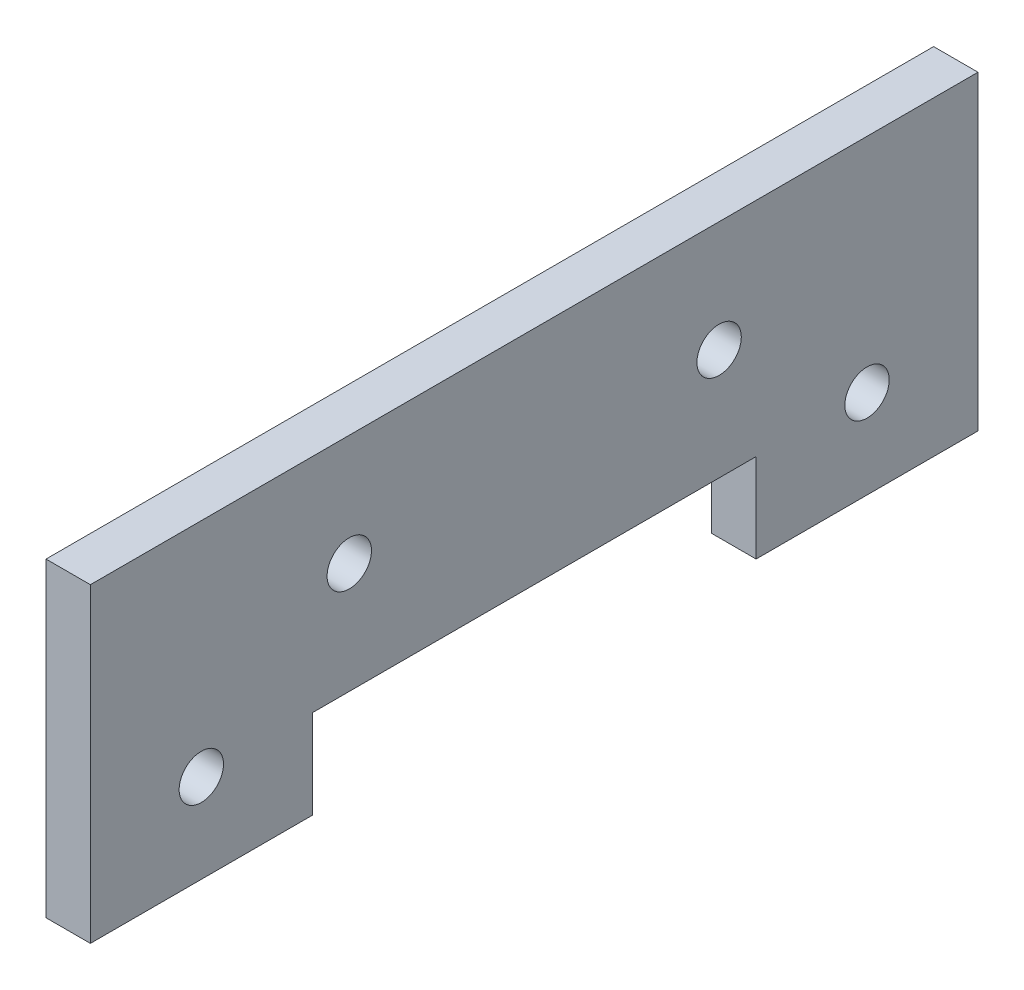
ISO-10303-21;
HEADER;
FILE_DESCRIPTION(('STEP AP214'),'2;1');
FILE_NAME('part.step','',(''),(''),'','','');
FILE_SCHEMA(('AUTOMOTIVE_DESIGN { 1 0 10303 214 1 1 1 1 }'));
ENDSEC;
DATA;
#1=APPLICATION_CONTEXT('core data for automotive mechanical design processes');
#2=APPLICATION_PROTOCOL_DEFINITION('international standard','automotive_design',2000,#1);
#3=PRODUCT_CONTEXT('',#1,'mechanical');
#4=PRODUCT('Part','Part','',(#3));
#5=PRODUCT_RELATED_PRODUCT_CATEGORY('part','',(#4));
#6=PRODUCT_DEFINITION_FORMATION('','',#4);
#7=PRODUCT_DEFINITION_CONTEXT('part definition',#1,'design');
#8=PRODUCT_DEFINITION('design','',#6,#7);
#9=PRODUCT_DEFINITION_SHAPE('','',#8);
#10=(LENGTH_UNIT() NAMED_UNIT(*) SI_UNIT(.MILLI.,.METRE.));
#11=(NAMED_UNIT(*) PLANE_ANGLE_UNIT() SI_UNIT($,.RADIAN.));
#12=(NAMED_UNIT(*) SI_UNIT($,.STERADIAN.) SOLID_ANGLE_UNIT());
#13=UNCERTAINTY_MEASURE_WITH_UNIT(LENGTH_MEASURE(1.E-05),#10,'distance_accuracy_value','');
#14=(GEOMETRIC_REPRESENTATION_CONTEXT(3) GLOBAL_UNCERTAINTY_ASSIGNED_CONTEXT((#13)) GLOBAL_UNIT_ASSIGNED_CONTEXT((#10,
#11,#12)) REPRESENTATION_CONTEXT('',''));
#15=CARTESIAN_POINT('',(0.,0.,0.));
#16=DIRECTION('',(0.,0.,1.));
#17=DIRECTION('',(1.,0.,0.));
#18=AXIS2_PLACEMENT_3D('',#15,#16,#17);
#19=CARTESIAN_POINT('',(3.,-21.,0.));
#20=DIRECTION('',(0.,0.,-1.));
#21=DIRECTION('',(-1.,0.,0.));
#22=AXIS2_PLACEMENT_3D('',#19,#20,#21);
#23=PLANE('',#22);
#24=DIRECTION('',(0.,-1.,0.));
#25=VECTOR('',#24,1.);
#26=CARTESIAN_POINT('',(0.,-21.,0.));
#27=LINE('',#26,#25);
#28=CARTESIAN_POINT('',(0.,0.,0.));
#29=VERTEX_POINT('',#28);
#30=CARTESIAN_POINT('',(0.,-21.,0.));
#31=VERTEX_POINT('',#30);
#32=EDGE_CURVE('E135',#29,#31,#27,.T.);
#33=ORIENTED_EDGE('',*,*,#32,.T.);
#34=DIRECTION('',(-1.,0.,0.));
#35=VECTOR('',#34,1.);
#36=CARTESIAN_POINT('',(3.,-21.,0.));
#37=LINE('',#36,#35);
#38=CARTESIAN_POINT('',(3.,-21.,0.));
#39=VERTEX_POINT('',#38);
#40=EDGE_CURVE('E11',#39,#31,#37,.T.);
#41=ORIENTED_EDGE('',*,*,#40,.F.);
#42=DIRECTION('',(0.,-1.,0.));
#43=VECTOR('',#42,1.);
#44=CARTESIAN_POINT('',(3.,-21.,0.));
#45=LINE('',#44,#43);
#46=CARTESIAN_POINT('',(3.,0.,0.));
#47=VERTEX_POINT('',#46);
#48=EDGE_CURVE('E150',#47,#39,#45,.T.);
#49=ORIENTED_EDGE('',*,*,#48,.F.);
#50=DIRECTION('',(-1.,0.,0.));
#51=VECTOR('',#50,1.);
#52=CARTESIAN_POINT('',(3.,0.,0.));
#53=LINE('',#52,#51);
#54=EDGE_CURVE('E131',#47,#29,#53,.T.);
#55=ORIENTED_EDGE('',*,*,#54,.T.);
#56=EDGE_LOOP('',(#33,#41,#49,#55));
#57=FACE_BOUND('',#56,.T.);
#58=ADVANCED_FACE('F39',(#57),#23,.F.);
#59=CARTESIAN_POINT('',(3.,-21.,-15.));
#60=DIRECTION('',(0.,1.,0.));
#61=DIRECTION('',(0.,0.,1.));
#62=AXIS2_PLACEMENT_3D('',#59,#60,#61);
#63=PLANE('',#62);
#64=DIRECTION('',(0.,0.,-1.));
#65=VECTOR('',#64,1.);
#66=CARTESIAN_POINT('',(0.,-21.,-15.));
#67=LINE('',#66,#65);
#68=CARTESIAN_POINT('',(0.,-21.,-15.));
#69=VERTEX_POINT('',#68);
#70=EDGE_CURVE('E138',#31,#69,#67,.T.);
#71=ORIENTED_EDGE('',*,*,#70,.T.);
#72=DIRECTION('',(-1.,0.,0.));
#73=VECTOR('',#72,1.);
#74=CARTESIAN_POINT('',(3.,-21.,-15.));
#75=LINE('',#74,#73);
#76=CARTESIAN_POINT('',(3.,-21.,-15.));
#77=VERTEX_POINT('',#76);
#78=EDGE_CURVE('E47',#77,#69,#75,.T.);
#79=ORIENTED_EDGE('',*,*,#78,.F.);
#80=DIRECTION('',(0.,0.,-1.));
#81=VECTOR('',#80,1.);
#82=CARTESIAN_POINT('',(3.,-21.,-15.));
#83=LINE('',#82,#81);
#84=EDGE_CURVE('E98',#39,#77,#83,.T.);
#85=ORIENTED_EDGE('',*,*,#84,.F.);
#86=ORIENTED_EDGE('',*,*,#40,.T.);
#87=EDGE_LOOP('',(#71,#79,#85,#86));
#88=FACE_BOUND('',#87,.T.);
#89=ADVANCED_FACE('F235',(#88),#63,.F.);
#90=CARTESIAN_POINT('',(3.,-15.,-15.));
#91=DIRECTION('',(0.,0.,1.));
#92=DIRECTION('',(0.,-1.,0.));
#93=AXIS2_PLACEMENT_3D('',#90,#91,#92);
#94=PLANE('',#93);
#95=DIRECTION('',(0.,1.,0.));
#96=VECTOR('',#95,1.);
#97=CARTESIAN_POINT('',(0.,-15.,-15.));
#98=LINE('',#97,#96);
#99=CARTESIAN_POINT('',(0.,-15.,-15.));
#100=VERTEX_POINT('',#99);
#101=EDGE_CURVE('E141',#69,#100,#98,.T.);
#102=ORIENTED_EDGE('',*,*,#101,.T.);
#103=DIRECTION('',(-1.,0.,0.));
#104=VECTOR('',#103,1.);
#105=CARTESIAN_POINT('',(3.,-15.,-15.));
#106=LINE('',#105,#104);
#107=CARTESIAN_POINT('',(3.,-15.,-15.));
#108=VERTEX_POINT('',#107);
#109=EDGE_CURVE('E157',#108,#100,#106,.T.);
#110=ORIENTED_EDGE('',*,*,#109,.F.);
#111=DIRECTION('',(0.,1.,0.));
#112=VECTOR('',#111,1.);
#113=CARTESIAN_POINT('',(3.,-15.,-15.));
#114=LINE('',#113,#112);
#115=EDGE_CURVE('E165',#77,#108,#114,.T.);
#116=ORIENTED_EDGE('',*,*,#115,.F.);
#117=ORIENTED_EDGE('',*,*,#78,.T.);
#118=EDGE_LOOP('',(#102,#110,#116,#117));
#119=FACE_BOUND('',#118,.T.);
#120=ADVANCED_FACE('F163',(#119),#94,.F.);
#121=CARTESIAN_POINT('',(3.,-15.,-45.));
#122=DIRECTION('',(0.,1.,0.));
#123=DIRECTION('',(0.,0.,1.));
#124=AXIS2_PLACEMENT_3D('',#121,#122,#123);
#125=PLANE('',#124);
#126=DIRECTION('',(0.,0.,-1.));
#127=VECTOR('',#126,1.);
#128=CARTESIAN_POINT('',(0.,-15.,-45.));
#129=LINE('',#128,#127);
#130=CARTESIAN_POINT('',(0.,-15.,-45.));
#131=VERTEX_POINT('',#130);
#132=EDGE_CURVE('E143',#100,#131,#129,.T.);
#133=ORIENTED_EDGE('',*,*,#132,.T.);
#134=DIRECTION('',(-1.,0.,0.));
#135=VECTOR('',#134,1.);
#136=CARTESIAN_POINT('',(3.,-15.,-45.));
#137=LINE('',#136,#135);
#138=CARTESIAN_POINT('',(3.,-15.,-45.));
#139=VERTEX_POINT('',#138);
#140=EDGE_CURVE('E154',#139,#131,#137,.T.);
#141=ORIENTED_EDGE('',*,*,#140,.F.);
#142=DIRECTION('',(0.,0.,-1.));
#143=VECTOR('',#142,1.);
#144=CARTESIAN_POINT('',(3.,-15.,-45.));
#145=LINE('',#144,#143);
#146=EDGE_CURVE('E177',#108,#139,#145,.T.);
#147=ORIENTED_EDGE('',*,*,#146,.F.);
#148=ORIENTED_EDGE('',*,*,#109,.T.);
#149=EDGE_LOOP('',(#133,#141,#147,#148));
#150=FACE_BOUND('',#149,.T.);
#151=ADVANCED_FACE('F173',(#150),#125,.F.);
#152=CARTESIAN_POINT('',(3.,-21.,-45.));
#153=DIRECTION('',(0.,0.,-1.));
#154=DIRECTION('',(-1.,0.,0.));
#155=AXIS2_PLACEMENT_3D('',#152,#153,#154);
#156=PLANE('',#155);
#157=DIRECTION('',(0.,-1.,0.));
#158=VECTOR('',#157,1.);
#159=CARTESIAN_POINT('',(0.,-21.,-45.));
#160=LINE('',#159,#158);
#161=CARTESIAN_POINT('',(0.,-21.,-45.));
#162=VERTEX_POINT('',#161);
#163=EDGE_CURVE('E145',#131,#162,#160,.T.);
#164=ORIENTED_EDGE('',*,*,#163,.T.);
#165=DIRECTION('',(-1.,0.,0.));
#166=VECTOR('',#165,1.);
#167=CARTESIAN_POINT('',(3.,-21.,-45.));
#168=LINE('',#167,#166);
#169=CARTESIAN_POINT('',(3.,-21.,-45.));
#170=VERTEX_POINT('',#169);
#171=EDGE_CURVE('E126',#170,#162,#168,.T.);
#172=ORIENTED_EDGE('',*,*,#171,.F.);
#173=DIRECTION('',(0.,-1.,0.));
#174=VECTOR('',#173,1.);
#175=CARTESIAN_POINT('',(3.,-21.,-45.));
#176=LINE('',#175,#174);
#177=EDGE_CURVE('E117',#139,#170,#176,.T.);
#178=ORIENTED_EDGE('',*,*,#177,.F.);
#179=ORIENTED_EDGE('',*,*,#140,.T.);
#180=EDGE_LOOP('',(#164,#172,#178,#179));
#181=FACE_BOUND('',#180,.T.);
#182=ADVANCED_FACE('F176',(#181),#156,.F.);
#183=CARTESIAN_POINT('',(3.,-21.,-60.));
#184=DIRECTION('',(0.,1.,0.));
#185=DIRECTION('',(0.,0.,1.));
#186=AXIS2_PLACEMENT_3D('',#183,#184,#185);
#187=PLANE('',#186);
#188=DIRECTION('',(0.,0.,-1.));
#189=VECTOR('',#188,1.);
#190=CARTESIAN_POINT('',(0.,-21.,-60.));
#191=LINE('',#190,#189);
#192=CARTESIAN_POINT('',(0.,-21.,-60.));
#193=VERTEX_POINT('',#192);
#194=EDGE_CURVE('E125',#162,#193,#191,.T.);
#195=ORIENTED_EDGE('',*,*,#194,.T.);
#196=DIRECTION('',(-1.,0.,0.));
#197=VECTOR('',#196,1.);
#198=CARTESIAN_POINT('',(3.,-21.,-60.));
#199=LINE('',#198,#197);
#200=CARTESIAN_POINT('',(3.,-21.,-60.));
#201=VERTEX_POINT('',#200);
#202=EDGE_CURVE('E122',#201,#193,#199,.T.);
#203=ORIENTED_EDGE('',*,*,#202,.F.);
#204=DIRECTION('',(0.,0.,-1.));
#205=VECTOR('',#204,1.);
#206=CARTESIAN_POINT('',(3.,-21.,-60.));
#207=LINE('',#206,#205);
#208=EDGE_CURVE('E111',#170,#201,#207,.T.);
#209=ORIENTED_EDGE('',*,*,#208,.F.);
#210=ORIENTED_EDGE('',*,*,#171,.T.);
#211=EDGE_LOOP('',(#195,#203,#209,#210));
#212=FACE_BOUND('',#211,.T.);
#213=ADVANCED_FACE('F123',(#212),#187,.F.);
#214=CARTESIAN_POINT('',(3.,0.,-60.));
#215=DIRECTION('',(0.,0.,1.));
#216=DIRECTION('',(1.,0.,0.));
#217=AXIS2_PLACEMENT_3D('',#214,#215,#216);
#218=PLANE('',#217);
#219=DIRECTION('',(0.,1.,0.));
#220=VECTOR('',#219,1.);
#221=CARTESIAN_POINT('',(0.,0.,-60.));
#222=LINE('',#221,#220);
#223=CARTESIAN_POINT('',(0.,0.,-60.));
#224=VERTEX_POINT('',#223);
#225=EDGE_CURVE('E84',#193,#224,#222,.T.);
#226=ORIENTED_EDGE('',*,*,#225,.T.);
#227=DIRECTION('',(-1.,0.,0.));
#228=VECTOR('',#227,1.);
#229=CARTESIAN_POINT('',(3.,0.,-60.));
#230=LINE('',#229,#228);
#231=CARTESIAN_POINT('',(3.,0.,-60.));
#232=VERTEX_POINT('',#231);
#233=EDGE_CURVE('E127',#232,#224,#230,.T.);
#234=ORIENTED_EDGE('',*,*,#233,.F.);
#235=DIRECTION('',(0.,1.,0.));
#236=VECTOR('',#235,1.);
#237=CARTESIAN_POINT('',(3.,0.,-60.));
#238=LINE('',#237,#236);
#239=EDGE_CURVE('E115',#201,#232,#238,.T.);
#240=ORIENTED_EDGE('',*,*,#239,.F.);
#241=ORIENTED_EDGE('',*,*,#202,.T.);
#242=EDGE_LOOP('',(#226,#234,#240,#241));
#243=FACE_BOUND('',#242,.T.);
#244=ADVANCED_FACE('F129',(#243),#218,.F.);
#245=CARTESIAN_POINT('',(3.,0.,0.));
#246=DIRECTION('',(0.,-1.,0.));
#247=DIRECTION('',(0.,0.,-1.));
#248=AXIS2_PLACEMENT_3D('',#245,#246,#247);
#249=PLANE('',#248);
#250=DIRECTION('',(0.,0.,1.));
#251=VECTOR('',#250,1.);
#252=CARTESIAN_POINT('',(0.,0.,0.));
#253=LINE('',#252,#251);
#254=EDGE_CURVE('E90',#224,#29,#253,.T.);
#255=ORIENTED_EDGE('',*,*,#254,.T.);
#256=ORIENTED_EDGE('',*,*,#54,.F.);
#257=DIRECTION('',(0.,0.,1.));
#258=VECTOR('',#257,1.);
#259=CARTESIAN_POINT('',(3.,0.,0.));
#260=LINE('',#259,#258);
#261=EDGE_CURVE('E55',#232,#47,#260,.T.);
#262=ORIENTED_EDGE('',*,*,#261,.F.);
#263=ORIENTED_EDGE('',*,*,#233,.T.);
#264=EDGE_LOOP('',(#255,#256,#262,#263));
#265=FACE_BOUND('',#264,.T.);
#266=ADVANCED_FACE('F219',(#265),#249,.F.);
#267=CARTESIAN_POINT('',(3.,0.,0.));
#268=DIRECTION('',(-1.,0.,0.));
#269=DIRECTION('',(0.,0.,1.));
#270=AXIS2_PLACEMENT_3D('',#267,#268,#269);
#271=PLANE('',#270);
#272=CARTESIAN_POINT('',(3.,-15.,-7.5));
#273=DIRECTION('',(1.,0.,0.));
#274=DIRECTION('',(0.,0.,-1.));
#275=AXIS2_PLACEMENT_3D('',#272,#273,#274);
#276=CIRCLE('',#275,1.5);
#277=CARTESIAN_POINT('',(3.,-15.,-9.));
#278=VERTEX_POINT('',#277);
#279=EDGE_CURVE('E189',#278,#278,#276,.T.);
#280=ORIENTED_EDGE('',*,*,#279,.F.);
#281=EDGE_LOOP('',(#280));
#282=FACE_BOUND('',#281,.T.);
#283=CARTESIAN_POINT('',(3.,-15.,-52.5));
#284=DIRECTION('',(1.,0.,0.));
#285=DIRECTION('',(0.,0.,-1.));
#286=AXIS2_PLACEMENT_3D('',#283,#284,#285);
#287=CIRCLE('',#286,1.5);
#288=CARTESIAN_POINT('',(3.,-15.,-54.));
#289=VERTEX_POINT('',#288);
#290=EDGE_CURVE('E195',#289,#289,#287,.T.);
#291=ORIENTED_EDGE('',*,*,#290,.F.);
#292=EDGE_LOOP('',(#291));
#293=FACE_BOUND('',#292,.T.);
#294=CARTESIAN_POINT('',(3.,-7.5,-17.5));
#295=DIRECTION('',(1.,0.,0.));
#296=DIRECTION('',(0.,0.,-1.));
#297=AXIS2_PLACEMENT_3D('',#294,#295,#296);
#298=CIRCLE('',#297,1.5);
#299=CARTESIAN_POINT('',(3.,-7.5,-19.));
#300=VERTEX_POINT('',#299);
#301=EDGE_CURVE('E201',#300,#300,#298,.T.);
#302=ORIENTED_EDGE('',*,*,#301,.F.);
#303=EDGE_LOOP('',(#302));
#304=FACE_BOUND('',#303,.T.);
#305=CARTESIAN_POINT('',(3.,-7.5,-42.5));
#306=DIRECTION('',(1.,0.,0.));
#307=DIRECTION('',(0.,0.,-1.));
#308=AXIS2_PLACEMENT_3D('',#305,#306,#307);
#309=CIRCLE('',#308,1.5);
#310=CARTESIAN_POINT('',(3.,-7.5,-44.));
#311=VERTEX_POINT('',#310);
#312=EDGE_CURVE('E183',#311,#311,#309,.T.);
#313=ORIENTED_EDGE('',*,*,#312,.F.);
#314=EDGE_LOOP('',(#313));
#315=FACE_BOUND('',#314,.T.);
#316=ORIENTED_EDGE('',*,*,#48,.T.);
#317=ORIENTED_EDGE('',*,*,#84,.T.);
#318=ORIENTED_EDGE('',*,*,#115,.T.);
#319=ORIENTED_EDGE('',*,*,#146,.T.);
#320=ORIENTED_EDGE('',*,*,#177,.T.);
#321=ORIENTED_EDGE('',*,*,#208,.T.);
#322=ORIENTED_EDGE('',*,*,#239,.T.);
#323=ORIENTED_EDGE('',*,*,#261,.T.);
#324=EDGE_LOOP('',(#316,#317,#318,#319,#320,#321,#322,#323));
#325=FACE_BOUND('',#324,.T.);
#326=ADVANCED_FACE('F113',(#282,#293,#304,#315,#325),#271,.F.);
#327=CARTESIAN_POINT('',(0.,0.,0.));
#328=DIRECTION('',(-1.,0.,0.));
#329=DIRECTION('',(0.,0.,1.));
#330=AXIS2_PLACEMENT_3D('',#327,#328,#329);
#331=PLANE('',#330);
#332=CARTESIAN_POINT('',(0.,-15.,-7.5));
#333=DIRECTION('',(1.,0.,0.));
#334=DIRECTION('',(0.,0.,-1.));
#335=AXIS2_PLACEMENT_3D('',#332,#333,#334);
#336=CIRCLE('',#335,1.5);
#337=CARTESIAN_POINT('',(0.,-15.,-9.));
#338=VERTEX_POINT('',#337);
#339=EDGE_CURVE('E192',#338,#338,#336,.T.);
#340=ORIENTED_EDGE('',*,*,#339,.T.);
#341=EDGE_LOOP('',(#340));
#342=FACE_BOUND('',#341,.T.);
#343=CARTESIAN_POINT('',(0.,-15.,-52.5));
#344=DIRECTION('',(1.,0.,0.));
#345=DIRECTION('',(0.,0.,-1.));
#346=AXIS2_PLACEMENT_3D('',#343,#344,#345);
#347=CIRCLE('',#346,1.5);
#348=CARTESIAN_POINT('',(0.,-15.,-54.));
#349=VERTEX_POINT('',#348);
#350=EDGE_CURVE('E198',#349,#349,#347,.T.);
#351=ORIENTED_EDGE('',*,*,#350,.T.);
#352=EDGE_LOOP('',(#351));
#353=FACE_BOUND('',#352,.T.);
#354=CARTESIAN_POINT('',(0.,-7.5,-17.5));
#355=DIRECTION('',(1.,0.,0.));
#356=DIRECTION('',(0.,0.,-1.));
#357=AXIS2_PLACEMENT_3D('',#354,#355,#356);
#358=CIRCLE('',#357,1.5);
#359=CARTESIAN_POINT('',(0.,-7.5,-19.));
#360=VERTEX_POINT('',#359);
#361=EDGE_CURVE('E186',#360,#360,#358,.T.);
#362=ORIENTED_EDGE('',*,*,#361,.T.);
#363=EDGE_LOOP('',(#362));
#364=FACE_BOUND('',#363,.T.);
#365=CARTESIAN_POINT('',(0.,-7.5,-42.5));
#366=DIRECTION('',(1.,0.,0.));
#367=DIRECTION('',(0.,0.,-1.));
#368=AXIS2_PLACEMENT_3D('',#365,#366,#367);
#369=CIRCLE('',#368,1.5);
#370=CARTESIAN_POINT('',(0.,-7.5,-44.));
#371=VERTEX_POINT('',#370);
#372=EDGE_CURVE('E139',#371,#371,#369,.T.);
#373=ORIENTED_EDGE('',*,*,#372,.T.);
#374=EDGE_LOOP('',(#373));
#375=FACE_BOUND('',#374,.T.);
#376=ORIENTED_EDGE('',*,*,#32,.F.);
#377=ORIENTED_EDGE('',*,*,#254,.F.);
#378=ORIENTED_EDGE('',*,*,#225,.F.);
#379=ORIENTED_EDGE('',*,*,#194,.F.);
#380=ORIENTED_EDGE('',*,*,#163,.F.);
#381=ORIENTED_EDGE('',*,*,#132,.F.);
#382=ORIENTED_EDGE('',*,*,#101,.F.);
#383=ORIENTED_EDGE('',*,*,#70,.F.);
#384=EDGE_LOOP('',(#376,#377,#378,#379,#380,#381,#382,#383));
#385=FACE_BOUND('',#384,.T.);
#386=ADVANCED_FACE('F169',(#342,#353,#364,#375,#385),#331,.T.);
#387=CARTESIAN_POINT('',(0.,-7.5,-42.5));
#388=DIRECTION('',(1.,0.,0.));
#389=DIRECTION('',(0.,0.,-1.));
#390=AXIS2_PLACEMENT_3D('',#387,#388,#389);
#391=CYLINDRICAL_SURFACE('',#390,1.5);
#392=ORIENTED_EDGE('',*,*,#372,.F.);
#393=EDGE_LOOP('',(#392));
#394=FACE_BOUND('',#393,.T.);
#395=ORIENTED_EDGE('',*,*,#312,.T.);
#396=EDGE_LOOP('',(#395));
#397=FACE_BOUND('',#396,.T.);
#398=ADVANCED_FACE('F213',(#394,#397),#391,.F.);
#399=CARTESIAN_POINT('',(0.,-7.5,-17.5));
#400=DIRECTION('',(1.,0.,0.));
#401=DIRECTION('',(0.,0.,-1.));
#402=AXIS2_PLACEMENT_3D('',#399,#400,#401);
#403=CYLINDRICAL_SURFACE('',#402,1.5);
#404=ORIENTED_EDGE('',*,*,#361,.F.);
#405=EDGE_LOOP('',(#404));
#406=FACE_BOUND('',#405,.T.);
#407=ORIENTED_EDGE('',*,*,#301,.T.);
#408=EDGE_LOOP('',(#407));
#409=FACE_BOUND('',#408,.T.);
#410=ADVANCED_FACE('F209',(#406,#409),#403,.F.);
#411=CARTESIAN_POINT('',(0.,-15.,-52.5));
#412=DIRECTION('',(1.,0.,0.));
#413=DIRECTION('',(0.,0.,-1.));
#414=AXIS2_PLACEMENT_3D('',#411,#412,#413);
#415=CYLINDRICAL_SURFACE('',#414,1.5);
#416=ORIENTED_EDGE('',*,*,#350,.F.);
#417=EDGE_LOOP('',(#416));
#418=FACE_BOUND('',#417,.T.);
#419=ORIENTED_EDGE('',*,*,#290,.T.);
#420=EDGE_LOOP('',(#419));
#421=FACE_BOUND('',#420,.T.);
#422=ADVANCED_FACE('F212',(#418,#421),#415,.F.);
#423=CARTESIAN_POINT('',(0.,-15.,-7.5));
#424=DIRECTION('',(1.,0.,0.));
#425=DIRECTION('',(0.,0.,-1.));
#426=AXIS2_PLACEMENT_3D('',#423,#424,#425);
#427=CYLINDRICAL_SURFACE('',#426,1.5);
#428=ORIENTED_EDGE('',*,*,#339,.F.);
#429=EDGE_LOOP('',(#428));
#430=FACE_BOUND('',#429,.T.);
#431=ORIENTED_EDGE('',*,*,#279,.T.);
#432=EDGE_LOOP('',(#431));
#433=FACE_BOUND('',#432,.T.);
#434=ADVANCED_FACE('F311',(#430,#433),#427,.F.);
#435=CLOSED_SHELL('',(#58,#89,#120,#151,#182,#213,#244,#266,#326,#386,#398,#410,#422,#434));
#436=MANIFOLD_SOLID_BREP('B2',#435);
#437=ADVANCED_BREP_SHAPE_REPRESENTATION('',(#18,#436),#14);
#438=SHAPE_DEFINITION_REPRESENTATION(#9,#437);
ENDSEC;
END-ISO-10303-21;
